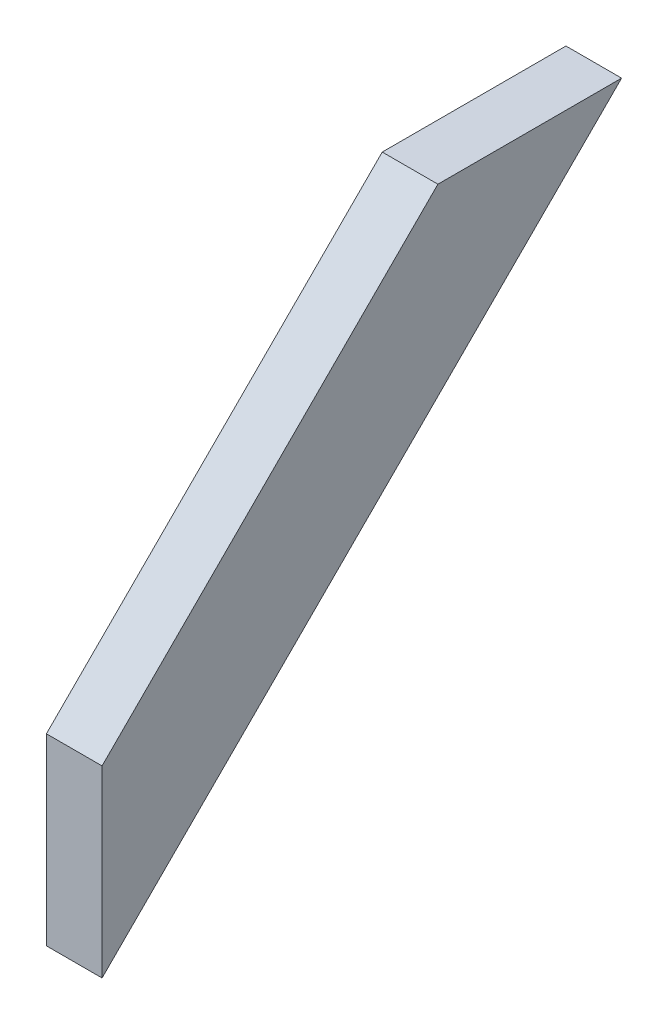
ISO-10303-21;
HEADER;
FILE_DESCRIPTION(('STEP AP214'),'2;1');
FILE_NAME('part.step','',(''),(''),'','','');
FILE_SCHEMA(('AUTOMOTIVE_DESIGN { 1 0 10303 214 1 1 1 1 }'));
ENDSEC;
DATA;
#1=APPLICATION_CONTEXT('core data for automotive mechanical design processes');
#2=APPLICATION_PROTOCOL_DEFINITION('international standard','automotive_design',2000,#1);
#3=PRODUCT_CONTEXT('',#1,'mechanical');
#4=PRODUCT('Part','Part','',(#3));
#5=PRODUCT_RELATED_PRODUCT_CATEGORY('part','',(#4));
#6=PRODUCT_DEFINITION_FORMATION('','',#4);
#7=PRODUCT_DEFINITION_CONTEXT('part definition',#1,'design');
#8=PRODUCT_DEFINITION('design','',#6,#7);
#9=PRODUCT_DEFINITION_SHAPE('','',#8);
#10=(LENGTH_UNIT() NAMED_UNIT(*) SI_UNIT(.MILLI.,.METRE.));
#11=(NAMED_UNIT(*) PLANE_ANGLE_UNIT() SI_UNIT($,.RADIAN.));
#12=(NAMED_UNIT(*) SI_UNIT($,.STERADIAN.) SOLID_ANGLE_UNIT());
#13=UNCERTAINTY_MEASURE_WITH_UNIT(LENGTH_MEASURE(1.E-05),#10,'distance_accuracy_value','');
#14=(GEOMETRIC_REPRESENTATION_CONTEXT(3) GLOBAL_UNCERTAINTY_ASSIGNED_CONTEXT((#13)) GLOBAL_UNIT_ASSIGNED_CONTEXT((#10,
#11,#12)) REPRESENTATION_CONTEXT('',''));
#15=CARTESIAN_POINT('',(0.,0.,0.));
#16=DIRECTION('',(0.,0.,1.));
#17=DIRECTION('',(1.,0.,0.));
#18=AXIS2_PLACEMENT_3D('',#15,#16,#17);
#19=CARTESIAN_POINT('',(38.1,355.6,-355.599999999997));
#20=DIRECTION('',(0.,0.707106781186544,0.707106781186551));
#21=DIRECTION('',(0.,-0.707106781186551,0.707106781186544));
#22=AXIS2_PLACEMENT_3D('',#19,#20,#21);
#23=PLANE('',#22);
#24=DIRECTION('',(0.,0.707106781186551,-0.707106781186544));
#25=VECTOR('',#24,1.);
#26=CARTESIAN_POINT('',(0.,355.6,-355.599999999997));
#27=LINE('',#26,#25);
#28=CARTESIAN_POINT('',(0.,0.,0.));
#29=VERTEX_POINT('',#28);
#30=CARTESIAN_POINT('',(0.,355.6,-355.599999999997));
#31=VERTEX_POINT('',#30);
#32=EDGE_CURVE('E96',#29,#31,#27,.T.);
#33=ORIENTED_EDGE('',*,*,#32,.T.);
#34=DIRECTION('',(-1.,0.,0.));
#35=VECTOR('',#34,1.);
#36=CARTESIAN_POINT('',(38.1,355.6,-355.599999999997));
#37=LINE('',#36,#35);
#38=CARTESIAN_POINT('',(38.1,355.6,-355.599999999997));
#39=VERTEX_POINT('',#38);
#40=EDGE_CURVE('E11',#39,#31,#37,.T.);
#41=ORIENTED_EDGE('',*,*,#40,.F.);
#42=DIRECTION('',(0.,0.707106781186551,-0.707106781186544));
#43=VECTOR('',#42,1.);
#44=CARTESIAN_POINT('',(38.1,355.6,-355.599999999997));
#45=LINE('',#44,#43);
#46=CARTESIAN_POINT('',(38.1,0.,0.));
#47=VERTEX_POINT('',#46);
#48=EDGE_CURVE('E84',#47,#39,#45,.T.);
#49=ORIENTED_EDGE('',*,*,#48,.F.);
#50=DIRECTION('',(-1.,0.,0.));
#51=VECTOR('',#50,1.);
#52=CARTESIAN_POINT('',(38.1,0.,0.));
#53=LINE('',#52,#51);
#54=EDGE_CURVE('E92',#47,#29,#53,.T.);
#55=ORIENTED_EDGE('',*,*,#54,.T.);
#56=EDGE_LOOP('',(#33,#41,#49,#55));
#57=FACE_BOUND('',#56,.T.);
#58=ADVANCED_FACE('F33',(#57),#23,.F.);
#59=CARTESIAN_POINT('',(38.1,355.6,-229.876414305029));
#60=DIRECTION('',(0.,-1.,0.));
#61=DIRECTION('',(0.,0.,-1.));
#62=AXIS2_PLACEMENT_3D('',#59,#60,#61);
#63=PLANE('',#62);
#64=DIRECTION('',(0.,0.,1.));
#65=VECTOR('',#64,1.);
#66=CARTESIAN_POINT('',(0.,355.6,-229.876414305029));
#67=LINE('',#66,#65);
#68=CARTESIAN_POINT('',(0.,355.6,-229.876414305029));
#69=VERTEX_POINT('',#68);
#70=EDGE_CURVE('E88',#31,#69,#67,.T.);
#71=ORIENTED_EDGE('',*,*,#70,.T.);
#72=DIRECTION('',(-1.,0.,0.));
#73=VECTOR('',#72,1.);
#74=CARTESIAN_POINT('',(38.1,355.6,-229.876414305029));
#75=LINE('',#74,#73);
#76=CARTESIAN_POINT('',(38.1,355.6,-229.876414305029));
#77=VERTEX_POINT('',#76);
#78=EDGE_CURVE('E41',#77,#69,#75,.T.);
#79=ORIENTED_EDGE('',*,*,#78,.F.);
#80=DIRECTION('',(0.,0.,1.));
#81=VECTOR('',#80,1.);
#82=CARTESIAN_POINT('',(38.1,355.6,-229.876414305029));
#83=LINE('',#82,#81);
#84=EDGE_CURVE('E79',#39,#77,#83,.T.);
#85=ORIENTED_EDGE('',*,*,#84,.F.);
#86=ORIENTED_EDGE('',*,*,#40,.T.);
#87=EDGE_LOOP('',(#71,#79,#85,#86));
#88=FACE_BOUND('',#87,.T.);
#89=ADVANCED_FACE('F87',(#88),#63,.F.);
#90=CARTESIAN_POINT('',(38.1,125.723585694969,0.));
#91=DIRECTION('',(0.,-0.707106781186544,-0.707106781186551));
#92=DIRECTION('',(0.,0.707106781186551,-0.707106781186544));
#93=AXIS2_PLACEMENT_3D('',#90,#91,#92);
#94=PLANE('',#93);
#95=DIRECTION('',(0.,-0.707106781186551,0.707106781186544));
#96=VECTOR('',#95,1.);
#97=CARTESIAN_POINT('',(0.,125.723585694969,0.));
#98=LINE('',#97,#96);
#99=CARTESIAN_POINT('',(0.,125.723585694969,0.));
#100=VERTEX_POINT('',#99);
#101=EDGE_CURVE('E66',#69,#100,#98,.T.);
#102=ORIENTED_EDGE('',*,*,#101,.T.);
#103=DIRECTION('',(-1.,0.,0.));
#104=VECTOR('',#103,1.);
#105=CARTESIAN_POINT('',(38.1,125.723585694969,0.));
#106=LINE('',#105,#104);
#107=CARTESIAN_POINT('',(38.1,125.723585694969,0.));
#108=VERTEX_POINT('',#107);
#109=EDGE_CURVE('E89',#108,#100,#106,.T.);
#110=ORIENTED_EDGE('',*,*,#109,.F.);
#111=DIRECTION('',(0.,-0.707106781186551,0.707106781186544));
#112=VECTOR('',#111,1.);
#113=CARTESIAN_POINT('',(38.1,125.723585694969,0.));
#114=LINE('',#113,#112);
#115=EDGE_CURVE('E82',#77,#108,#114,.T.);
#116=ORIENTED_EDGE('',*,*,#115,.F.);
#117=ORIENTED_EDGE('',*,*,#78,.T.);
#118=EDGE_LOOP('',(#102,#110,#116,#117));
#119=FACE_BOUND('',#118,.T.);
#120=ADVANCED_FACE('F90',(#119),#94,.F.);
#121=CARTESIAN_POINT('',(38.1,0.,0.));
#122=DIRECTION('',(0.,0.,-1.));
#123=DIRECTION('',(-1.,0.,0.));
#124=AXIS2_PLACEMENT_3D('',#121,#122,#123);
#125=PLANE('',#124);
#126=DIRECTION('',(0.,-1.,0.));
#127=VECTOR('',#126,1.);
#128=CARTESIAN_POINT('',(0.,0.,0.));
#129=LINE('',#128,#127);
#130=EDGE_CURVE('E72',#100,#29,#129,.T.);
#131=ORIENTED_EDGE('',*,*,#130,.T.);
#132=ORIENTED_EDGE('',*,*,#54,.F.);
#133=DIRECTION('',(0.,-1.,0.));
#134=VECTOR('',#133,1.);
#135=CARTESIAN_POINT('',(38.1,0.,0.));
#136=LINE('',#135,#134);
#137=EDGE_CURVE('E49',#108,#47,#136,.T.);
#138=ORIENTED_EDGE('',*,*,#137,.F.);
#139=ORIENTED_EDGE('',*,*,#109,.T.);
#140=EDGE_LOOP('',(#131,#132,#138,#139));
#141=FACE_BOUND('',#140,.T.);
#142=ADVANCED_FACE('F103',(#141),#125,.F.);
#143=CARTESIAN_POINT('',(38.1,0.,0.));
#144=DIRECTION('',(-1.,0.,0.));
#145=DIRECTION('',(0.,0.,1.));
#146=AXIS2_PLACEMENT_3D('',#143,#144,#145);
#147=PLANE('',#146);
#148=ORIENTED_EDGE('',*,*,#48,.T.);
#149=ORIENTED_EDGE('',*,*,#84,.T.);
#150=ORIENTED_EDGE('',*,*,#115,.T.);
#151=ORIENTED_EDGE('',*,*,#137,.T.);
#152=EDGE_LOOP('',(#148,#149,#150,#151));
#153=FACE_BOUND('',#152,.T.);
#154=ADVANCED_FACE('F80',(#153),#147,.F.);
#155=CARTESIAN_POINT('',(0.,0.,0.));
#156=DIRECTION('',(-1.,0.,0.));
#157=DIRECTION('',(0.,0.,1.));
#158=AXIS2_PLACEMENT_3D('',#155,#156,#157);
#159=PLANE('',#158);
#160=ORIENTED_EDGE('',*,*,#32,.F.);
#161=ORIENTED_EDGE('',*,*,#130,.F.);
#162=ORIENTED_EDGE('',*,*,#101,.F.);
#163=ORIENTED_EDGE('',*,*,#70,.F.);
#164=EDGE_LOOP('',(#160,#161,#162,#163));
#165=FACE_BOUND('',#164,.T.);
#166=ADVANCED_FACE('F106',(#165),#159,.T.);
#167=CLOSED_SHELL('',(#58,#89,#120,#142,#154,#166));
#168=MANIFOLD_SOLID_BREP('B2',#167);
#169=ADVANCED_BREP_SHAPE_REPRESENTATION('',(#18,#168),#14);
#170=SHAPE_DEFINITION_REPRESENTATION(#9,#169);
ENDSEC;
END-ISO-10303-21;
